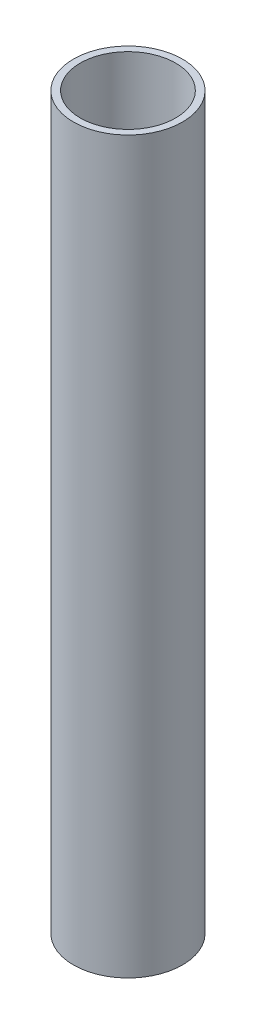
ISO-10303-21;
HEADER;
FILE_DESCRIPTION(('STEP AP214'),'2;1');
FILE_NAME('part.step','',(''),(''),'','','');
FILE_SCHEMA(('AUTOMOTIVE_DESIGN { 1 0 10303 214 1 1 1 1 }'));
ENDSEC;
DATA;
#1=APPLICATION_CONTEXT('core data for automotive mechanical design processes');
#2=APPLICATION_PROTOCOL_DEFINITION('international standard','automotive_design',2000,#1);
#3=PRODUCT_CONTEXT('',#1,'mechanical');
#4=PRODUCT('Part','Part','',(#3));
#5=PRODUCT_RELATED_PRODUCT_CATEGORY('part','',(#4));
#6=PRODUCT_DEFINITION_FORMATION('','',#4);
#7=PRODUCT_DEFINITION_CONTEXT('part definition',#1,'design');
#8=PRODUCT_DEFINITION('design','',#6,#7);
#9=PRODUCT_DEFINITION_SHAPE('','',#8);
#10=(LENGTH_UNIT() NAMED_UNIT(*) SI_UNIT(.MILLI.,.METRE.));
#11=(NAMED_UNIT(*) PLANE_ANGLE_UNIT() SI_UNIT($,.RADIAN.));
#12=(NAMED_UNIT(*) SI_UNIT($,.STERADIAN.) SOLID_ANGLE_UNIT());
#13=UNCERTAINTY_MEASURE_WITH_UNIT(LENGTH_MEASURE(1.E-05),#10,'distance_accuracy_value','');
#14=(GEOMETRIC_REPRESENTATION_CONTEXT(3) GLOBAL_UNCERTAINTY_ASSIGNED_CONTEXT((#13)) GLOBAL_UNIT_ASSIGNED_CONTEXT((#10,
#11,#12)) REPRESENTATION_CONTEXT('',''));
#15=CARTESIAN_POINT('',(0.,0.,0.));
#16=DIRECTION('',(0.,0.,1.));
#17=DIRECTION('',(1.,0.,0.));
#18=AXIS2_PLACEMENT_3D('',#15,#16,#17);
#19=CARTESIAN_POINT('',(0.,1.,0.));
#20=DIRECTION('',(0.,-1.,0.));
#21=DIRECTION('',(0.,0.,-1.));
#22=AXIS2_PLACEMENT_3D('',#19,#20,#21);
#23=PLANE('',#22);
#24=CARTESIAN_POINT('',(0.,1.,0.));
#25=DIRECTION('',(0.,1.,0.));
#26=DIRECTION('',(0.,0.,1.));
#27=AXIS2_PLACEMENT_3D('',#24,#25,#26);
#28=CIRCLE('',#27,5.55);
#29=CARTESIAN_POINT('',(0.,1.,5.55));
#30=VERTEX_POINT('',#29);
#31=EDGE_CURVE('E12',#30,#30,#28,.T.);
#32=ORIENTED_EDGE('',*,*,#31,.T.);
#33=EDGE_LOOP('',(#32));
#34=FACE_BOUND('',#33,.T.);
#35=ADVANCED_FACE('F46',(#34),#23,.F.);
#36=CARTESIAN_POINT('',(0.,1.,0.));
#37=DIRECTION('',(0.,1.,0.));
#38=DIRECTION('',(0.,0.,1.));
#39=AXIS2_PLACEMENT_3D('',#36,#37,#38);
#40=CYLINDRICAL_SURFACE('',#39,5.55);
#41=ORIENTED_EDGE('',*,*,#31,.F.);
#42=EDGE_LOOP('',(#41));
#43=FACE_BOUND('',#42,.T.);
#44=CARTESIAN_POINT('',(0.,85.,0.));
#45=DIRECTION('',(0.,1.,0.));
#46=DIRECTION('',(0.,0.,1.));
#47=AXIS2_PLACEMENT_3D('',#44,#45,#46);
#48=CIRCLE('',#47,5.55);
#49=CARTESIAN_POINT('',(0.,85.,5.55));
#50=VERTEX_POINT('',#49);
#51=EDGE_CURVE('E53',#50,#50,#48,.T.);
#52=ORIENTED_EDGE('',*,*,#51,.T.);
#53=EDGE_LOOP('',(#52));
#54=FACE_BOUND('',#53,.T.);
#55=ADVANCED_FACE('F82',(#43,#54),#40,.F.);
#56=CARTESIAN_POINT('',(5.55,85.,0.));
#57=DIRECTION('',(0.,-1.,0.));
#58=DIRECTION('',(0.,0.,-1.));
#59=AXIS2_PLACEMENT_3D('',#56,#57,#58);
#60=PLANE('',#59);
#61=ORIENTED_EDGE('',*,*,#51,.F.);
#62=EDGE_LOOP('',(#61));
#63=FACE_BOUND('',#62,.T.);
#64=CARTESIAN_POINT('',(0.,85.,0.));
#65=DIRECTION('',(0.,1.,0.));
#66=DIRECTION('',(0.,0.,1.));
#67=AXIS2_PLACEMENT_3D('',#64,#65,#66);
#68=CIRCLE('',#67,6.35);
#69=CARTESIAN_POINT('',(0.,85.,6.35));
#70=VERTEX_POINT('',#69);
#71=EDGE_CURVE('E59',#70,#70,#68,.T.);
#72=ORIENTED_EDGE('',*,*,#71,.T.);
#73=EDGE_LOOP('',(#72));
#74=FACE_BOUND('',#73,.T.);
#75=ADVANCED_FACE('F78',(#63,#74),#60,.F.);
#76=CARTESIAN_POINT('',(0.,1.,0.));
#77=DIRECTION('',(0.,1.,0.));
#78=DIRECTION('',(0.,0.,1.));
#79=AXIS2_PLACEMENT_3D('',#76,#77,#78);
#80=CYLINDRICAL_SURFACE('',#79,6.35);
#81=ORIENTED_EDGE('',*,*,#71,.F.);
#82=EDGE_LOOP('',(#81));
#83=FACE_BOUND('',#82,.T.);
#84=CARTESIAN_POINT('',(0.,0.,0.));
#85=DIRECTION('',(0.,1.,0.));
#86=DIRECTION('',(0.,0.,1.));
#87=AXIS2_PLACEMENT_3D('',#84,#85,#86);
#88=CIRCLE('',#87,6.35);
#89=CARTESIAN_POINT('',(0.,0.,6.35));
#90=VERTEX_POINT('',#89);
#91=EDGE_CURVE('E64',#90,#90,#88,.T.);
#92=ORIENTED_EDGE('',*,*,#91,.T.);
#93=EDGE_LOOP('',(#92));
#94=FACE_BOUND('',#93,.T.);
#95=ADVANCED_FACE('F70',(#83,#94),#80,.T.);
#96=CARTESIAN_POINT('',(0.,0.,0.));
#97=DIRECTION('',(0.,1.,0.));
#98=DIRECTION('',(0.,0.,1.));
#99=AXIS2_PLACEMENT_3D('',#96,#97,#98);
#100=PLANE('',#99);
#101=ORIENTED_EDGE('',*,*,#91,.F.);
#102=EDGE_LOOP('',(#101));
#103=FACE_BOUND('',#102,.T.);
#104=ADVANCED_FACE('F72',(#103),#100,.F.);
#105=CLOSED_SHELL('',(#35,#55,#75,#95,#104));
#106=MANIFOLD_SOLID_BREP('B2',#105);
#107=ADVANCED_BREP_SHAPE_REPRESENTATION('',(#18,#106),#14);
#108=SHAPE_DEFINITION_REPRESENTATION(#9,#107);
ENDSEC;
END-ISO-10303-21;
